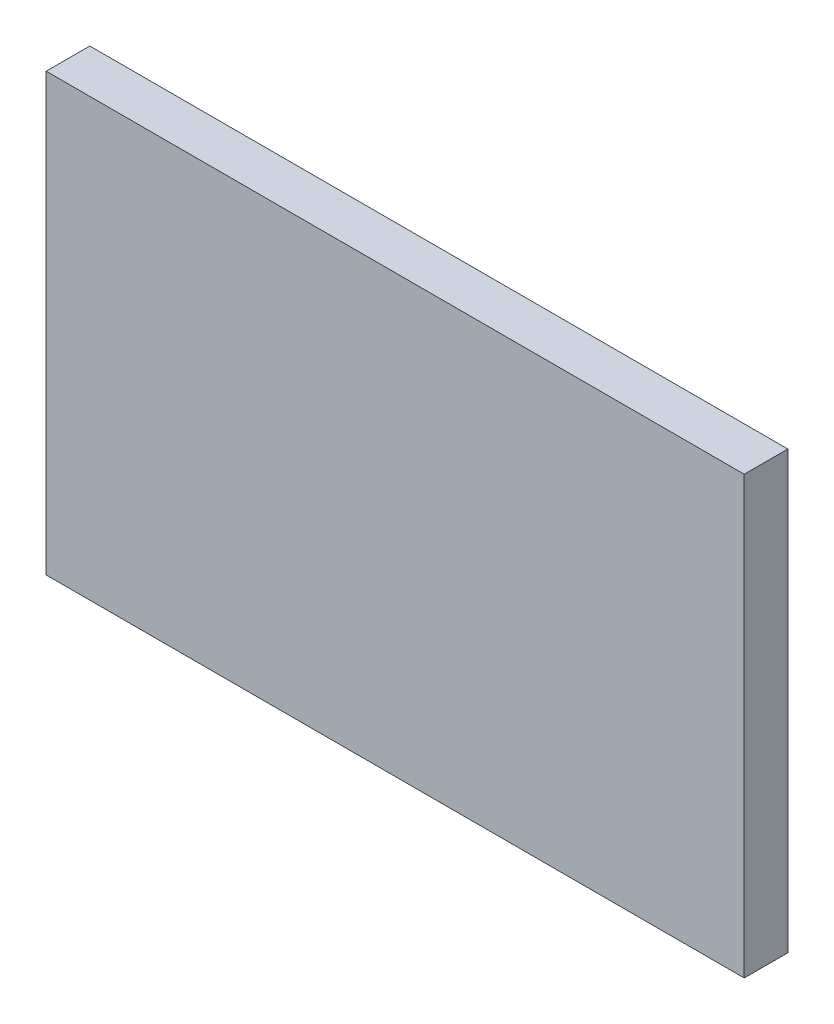
ISO-10303-21;
HEADER;
FILE_DESCRIPTION(('STEP AP214'),'2;1');
FILE_NAME('part.step','',(''),(''),'','','');
FILE_SCHEMA(('AUTOMOTIVE_DESIGN { 1 0 10303 214 1 1 1 1 }'));
ENDSEC;
DATA;
#1=APPLICATION_CONTEXT('core data for automotive mechanical design processes');
#2=APPLICATION_PROTOCOL_DEFINITION('international standard','automotive_design',2000,#1);
#3=PRODUCT_CONTEXT('',#1,'mechanical');
#4=PRODUCT('Part','Part','',(#3));
#5=PRODUCT_RELATED_PRODUCT_CATEGORY('part','',(#4));
#6=PRODUCT_DEFINITION_FORMATION('','',#4);
#7=PRODUCT_DEFINITION_CONTEXT('part definition',#1,'design');
#8=PRODUCT_DEFINITION('design','',#6,#7);
#9=PRODUCT_DEFINITION_SHAPE('','',#8);
#10=(LENGTH_UNIT() NAMED_UNIT(*) SI_UNIT(.MILLI.,.METRE.));
#11=(NAMED_UNIT(*) PLANE_ANGLE_UNIT() SI_UNIT($,.RADIAN.));
#12=(NAMED_UNIT(*) SI_UNIT($,.STERADIAN.) SOLID_ANGLE_UNIT());
#13=UNCERTAINTY_MEASURE_WITH_UNIT(LENGTH_MEASURE(1.E-05),#10,'distance_accuracy_value','');
#14=(GEOMETRIC_REPRESENTATION_CONTEXT(3) GLOBAL_UNCERTAINTY_ASSIGNED_CONTEXT((#13)) GLOBAL_UNIT_ASSIGNED_CONTEXT((#10,
#11,#12)) REPRESENTATION_CONTEXT('',''));
#15=CARTESIAN_POINT('',(0.,0.,0.));
#16=DIRECTION('',(0.,0.,1.));
#17=DIRECTION('',(1.,0.,0.));
#18=AXIS2_PLACEMENT_3D('',#15,#16,#17);
#19=CARTESIAN_POINT('',(0.,0.,6.35));
#20=DIRECTION('',(1.,0.,0.));
#21=DIRECTION('',(0.,0.,-1.));
#22=AXIS2_PLACEMENT_3D('',#19,#20,#21);
#23=PLANE('',#22);
#24=DIRECTION('',(0.,-1.,0.));
#25=VECTOR('',#24,1.);
#26=CARTESIAN_POINT('',(0.,0.,0.));
#27=LINE('',#26,#25);
#28=CARTESIAN_POINT('',(0.,63.5,0.));
#29=VERTEX_POINT('',#28);
#30=CARTESIAN_POINT('',(0.,0.,0.));
#31=VERTEX_POINT('',#30);
#32=EDGE_CURVE('E96',#29,#31,#27,.T.);
#33=ORIENTED_EDGE('',*,*,#32,.T.);
#34=DIRECTION('',(0.,0.,-1.));
#35=VECTOR('',#34,1.);
#36=CARTESIAN_POINT('',(0.,0.,6.35));
#37=LINE('',#36,#35);
#38=CARTESIAN_POINT('',(0.,0.,6.35));
#39=VERTEX_POINT('',#38);
#40=EDGE_CURVE('E11',#39,#31,#37,.T.);
#41=ORIENTED_EDGE('',*,*,#40,.F.);
#42=DIRECTION('',(0.,-1.,0.));
#43=VECTOR('',#42,1.);
#44=CARTESIAN_POINT('',(0.,0.,6.35));
#45=LINE('',#44,#43);
#46=CARTESIAN_POINT('',(0.,63.5,6.35));
#47=VERTEX_POINT('',#46);
#48=EDGE_CURVE('E84',#47,#39,#45,.T.);
#49=ORIENTED_EDGE('',*,*,#48,.F.);
#50=DIRECTION('',(0.,0.,-1.));
#51=VECTOR('',#50,1.);
#52=CARTESIAN_POINT('',(0.,63.5,6.35));
#53=LINE('',#52,#51);
#54=EDGE_CURVE('E92',#47,#29,#53,.T.);
#55=ORIENTED_EDGE('',*,*,#54,.T.);
#56=EDGE_LOOP('',(#33,#41,#49,#55));
#57=FACE_BOUND('',#56,.T.);
#58=ADVANCED_FACE('F33',(#57),#23,.F.);
#59=CARTESIAN_POINT('',(0.,0.,6.35));
#60=DIRECTION('',(0.,1.,0.));
#61=DIRECTION('',(0.,0.,1.));
#62=AXIS2_PLACEMENT_3D('',#59,#60,#61);
#63=PLANE('',#62);
#64=DIRECTION('',(1.,0.,0.));
#65=VECTOR('',#64,1.);
#66=CARTESIAN_POINT('',(0.,0.,0.));
#67=LINE('',#66,#65);
#68=CARTESIAN_POINT('',(101.6,0.,0.));
#69=VERTEX_POINT('',#68);
#70=EDGE_CURVE('E88',#31,#69,#67,.T.);
#71=ORIENTED_EDGE('',*,*,#70,.T.);
#72=DIRECTION('',(0.,0.,-1.));
#73=VECTOR('',#72,1.);
#74=CARTESIAN_POINT('',(101.6,0.,6.35));
#75=LINE('',#74,#73);
#76=CARTESIAN_POINT('',(101.6,0.,6.35));
#77=VERTEX_POINT('',#76);
#78=EDGE_CURVE('E41',#77,#69,#75,.T.);
#79=ORIENTED_EDGE('',*,*,#78,.F.);
#80=DIRECTION('',(1.,0.,0.));
#81=VECTOR('',#80,1.);
#82=CARTESIAN_POINT('',(0.,0.,6.35));
#83=LINE('',#82,#81);
#84=EDGE_CURVE('E79',#39,#77,#83,.T.);
#85=ORIENTED_EDGE('',*,*,#84,.F.);
#86=ORIENTED_EDGE('',*,*,#40,.T.);
#87=EDGE_LOOP('',(#71,#79,#85,#86));
#88=FACE_BOUND('',#87,.T.);
#89=ADVANCED_FACE('F87',(#88),#63,.F.);
#90=CARTESIAN_POINT('',(101.6,0.,6.35));
#91=DIRECTION('',(-1.,0.,0.));
#92=DIRECTION('',(0.,0.,1.));
#93=AXIS2_PLACEMENT_3D('',#90,#91,#92);
#94=PLANE('',#93);
#95=DIRECTION('',(0.,1.,0.));
#96=VECTOR('',#95,1.);
#97=CARTESIAN_POINT('',(101.6,0.,0.));
#98=LINE('',#97,#96);
#99=CARTESIAN_POINT('',(101.6,63.5,0.));
#100=VERTEX_POINT('',#99);
#101=EDGE_CURVE('E66',#69,#100,#98,.T.);
#102=ORIENTED_EDGE('',*,*,#101,.T.);
#103=DIRECTION('',(0.,0.,-1.));
#104=VECTOR('',#103,1.);
#105=CARTESIAN_POINT('',(101.6,63.5,6.35));
#106=LINE('',#105,#104);
#107=CARTESIAN_POINT('',(101.6,63.5,6.35));
#108=VERTEX_POINT('',#107);
#109=EDGE_CURVE('E89',#108,#100,#106,.T.);
#110=ORIENTED_EDGE('',*,*,#109,.F.);
#111=DIRECTION('',(0.,1.,0.));
#112=VECTOR('',#111,1.);
#113=CARTESIAN_POINT('',(101.6,0.,6.35));
#114=LINE('',#113,#112);
#115=EDGE_CURVE('E82',#77,#108,#114,.T.);
#116=ORIENTED_EDGE('',*,*,#115,.F.);
#117=ORIENTED_EDGE('',*,*,#78,.T.);
#118=EDGE_LOOP('',(#102,#110,#116,#117));
#119=FACE_BOUND('',#118,.T.);
#120=ADVANCED_FACE('F90',(#119),#94,.F.);
#121=CARTESIAN_POINT('',(0.,63.5,6.35));
#122=DIRECTION('',(0.,-1.,0.));
#123=DIRECTION('',(0.,0.,-1.));
#124=AXIS2_PLACEMENT_3D('',#121,#122,#123);
#125=PLANE('',#124);
#126=DIRECTION('',(-1.,0.,0.));
#127=VECTOR('',#126,1.);
#128=CARTESIAN_POINT('',(0.,63.5,0.));
#129=LINE('',#128,#127);
#130=EDGE_CURVE('E72',#100,#29,#129,.T.);
#131=ORIENTED_EDGE('',*,*,#130,.T.);
#132=ORIENTED_EDGE('',*,*,#54,.F.);
#133=DIRECTION('',(-1.,0.,0.));
#134=VECTOR('',#133,1.);
#135=CARTESIAN_POINT('',(0.,63.5,6.35));
#136=LINE('',#135,#134);
#137=EDGE_CURVE('E49',#108,#47,#136,.T.);
#138=ORIENTED_EDGE('',*,*,#137,.F.);
#139=ORIENTED_EDGE('',*,*,#109,.T.);
#140=EDGE_LOOP('',(#131,#132,#138,#139));
#141=FACE_BOUND('',#140,.T.);
#142=ADVANCED_FACE('F103',(#141),#125,.F.);
#143=CARTESIAN_POINT('',(0.,0.,6.35));
#144=DIRECTION('',(0.,0.,-1.));
#145=DIRECTION('',(-1.,0.,0.));
#146=AXIS2_PLACEMENT_3D('',#143,#144,#145);
#147=PLANE('',#146);
#148=ORIENTED_EDGE('',*,*,#48,.T.);
#149=ORIENTED_EDGE('',*,*,#84,.T.);
#150=ORIENTED_EDGE('',*,*,#115,.T.);
#151=ORIENTED_EDGE('',*,*,#137,.T.);
#152=EDGE_LOOP('',(#148,#149,#150,#151));
#153=FACE_BOUND('',#152,.T.);
#154=ADVANCED_FACE('F80',(#153),#147,.F.);
#155=CARTESIAN_POINT('',(0.,0.,0.));
#156=DIRECTION('',(0.,0.,-1.));
#157=DIRECTION('',(-1.,0.,0.));
#158=AXIS2_PLACEMENT_3D('',#155,#156,#157);
#159=PLANE('',#158);
#160=ORIENTED_EDGE('',*,*,#32,.F.);
#161=ORIENTED_EDGE('',*,*,#130,.F.);
#162=ORIENTED_EDGE('',*,*,#101,.F.);
#163=ORIENTED_EDGE('',*,*,#70,.F.);
#164=EDGE_LOOP('',(#160,#161,#162,#163));
#165=FACE_BOUND('',#164,.T.);
#166=ADVANCED_FACE('F106',(#165),#159,.T.);
#167=CLOSED_SHELL('',(#58,#89,#120,#142,#154,#166));
#168=MANIFOLD_SOLID_BREP('B2',#167);
#169=ADVANCED_BREP_SHAPE_REPRESENTATION('',(#18,#168),#14);
#170=SHAPE_DEFINITION_REPRESENTATION(#9,#169);
ENDSEC;
END-ISO-10303-21;
